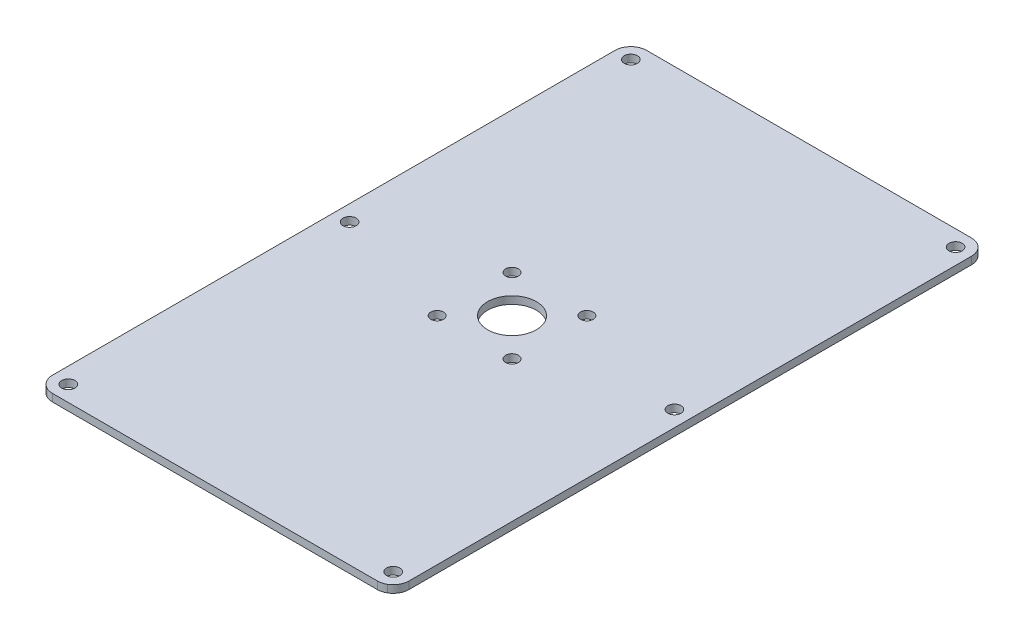
ISO-10303-21;
HEADER;
FILE_DESCRIPTION(('STEP AP214'),'2;1');
FILE_NAME('part.step','',(''),(''),'','','');
FILE_SCHEMA(('AUTOMOTIVE_DESIGN { 1 0 10303 214 1 1 1 1 }'));
ENDSEC;
DATA;
#1=APPLICATION_CONTEXT('core data for automotive mechanical design processes');
#2=APPLICATION_PROTOCOL_DEFINITION('international standard','automotive_design',2000,#1);
#3=PRODUCT_CONTEXT('',#1,'mechanical');
#4=PRODUCT('Part','Part','',(#3));
#5=PRODUCT_RELATED_PRODUCT_CATEGORY('part','',(#4));
#6=PRODUCT_DEFINITION_FORMATION('','',#4);
#7=PRODUCT_DEFINITION_CONTEXT('part definition',#1,'design');
#8=PRODUCT_DEFINITION('design','',#6,#7);
#9=PRODUCT_DEFINITION_SHAPE('','',#8);
#10=(LENGTH_UNIT() NAMED_UNIT(*) SI_UNIT(.MILLI.,.METRE.));
#11=(NAMED_UNIT(*) PLANE_ANGLE_UNIT() SI_UNIT($,.RADIAN.));
#12=(NAMED_UNIT(*) SI_UNIT($,.STERADIAN.) SOLID_ANGLE_UNIT());
#13=UNCERTAINTY_MEASURE_WITH_UNIT(LENGTH_MEASURE(1.E-05),#10,'distance_accuracy_value','');
#14=(GEOMETRIC_REPRESENTATION_CONTEXT(3) GLOBAL_UNCERTAINTY_ASSIGNED_CONTEXT((#13)) GLOBAL_UNIT_ASSIGNED_CONTEXT((#10,
#11,#12)) REPRESENTATION_CONTEXT('',''));
#15=CARTESIAN_POINT('',(0.,0.,0.));
#16=DIRECTION('',(0.,0.,1.));
#17=DIRECTION('',(1.,0.,0.));
#18=AXIS2_PLACEMENT_3D('',#15,#16,#17);
#19=CARTESIAN_POINT('',(0.,3.,0.));
#20=DIRECTION('',(0.,-1.,0.));
#21=DIRECTION('',(0.,0.,-1.));
#22=AXIS2_PLACEMENT_3D('',#19,#20,#21);
#23=PLANE('',#22);
#24=CARTESIAN_POINT('',(-15.,3.,15.));
#25=DIRECTION('',(0.,1.,0.));
#26=DIRECTION('',(0.,0.,1.));
#27=AXIS2_PLACEMENT_3D('',#24,#25,#26);
#28=CIRCLE('',#27,2.55);
#29=CARTESIAN_POINT('',(-15.,3.,17.55));
#30=VERTEX_POINT('',#29);
#31=EDGE_CURVE('E383',#30,#30,#28,.T.);
#32=ORIENTED_EDGE('',*,*,#31,.F.);
#33=EDGE_LOOP('',(#32));
#34=FACE_BOUND('',#33,.T.);
#35=CARTESIAN_POINT('',(15.,3.,15.));
#36=DIRECTION('',(0.,1.,0.));
#37=DIRECTION('',(0.,0.,1.));
#38=AXIS2_PLACEMENT_3D('',#35,#36,#37);
#39=CIRCLE('',#38,2.55);
#40=CARTESIAN_POINT('',(15.,3.,17.55));
#41=VERTEX_POINT('',#40);
#42=EDGE_CURVE('E393',#41,#41,#39,.T.);
#43=ORIENTED_EDGE('',*,*,#42,.F.);
#44=EDGE_LOOP('',(#43));
#45=FACE_BOUND('',#44,.T.);
#46=CARTESIAN_POINT('',(15.,3.,-15.));
#47=DIRECTION('',(0.,1.,0.));
#48=DIRECTION('',(0.,0.,1.));
#49=AXIS2_PLACEMENT_3D('',#46,#47,#48);
#50=CIRCLE('',#49,2.55);
#51=CARTESIAN_POINT('',(15.,3.,-12.45));
#52=VERTEX_POINT('',#51);
#53=EDGE_CURVE('E402',#52,#52,#50,.T.);
#54=ORIENTED_EDGE('',*,*,#53,.F.);
#55=EDGE_LOOP('',(#54));
#56=FACE_BOUND('',#55,.T.);
#57=CARTESIAN_POINT('',(-15.,3.,-15.));
#58=DIRECTION('',(0.,1.,0.));
#59=DIRECTION('',(0.,0.,1.));
#60=AXIS2_PLACEMENT_3D('',#57,#58,#59);
#61=CIRCLE('',#60,2.55);
#62=CARTESIAN_POINT('',(-15.,3.,-12.45));
#63=VERTEX_POINT('',#62);
#64=EDGE_CURVE('E380',#63,#63,#61,.T.);
#65=ORIENTED_EDGE('',*,*,#64,.F.);
#66=EDGE_LOOP('',(#65));
#67=FACE_BOUND('',#66,.T.);
#68=CARTESIAN_POINT('',(0.,3.,0.));
#69=DIRECTION('',(0.,1.,0.));
#70=DIRECTION('',(0.,0.,1.));
#71=AXIS2_PLACEMENT_3D('',#68,#69,#70);
#72=CIRCLE('',#71,9.779);
#73=CARTESIAN_POINT('',(0.,3.,9.779));
#74=VERTEX_POINT('',#73);
#75=EDGE_CURVE('E373',#74,#74,#72,.T.);
#76=ORIENTED_EDGE('',*,*,#75,.F.);
#77=EDGE_LOOP('',(#76));
#78=FACE_BOUND('',#77,.T.);
#79=CARTESIAN_POINT('',(65.0875,3.,-112.7125));
#80=DIRECTION('',(0.,1.,0.));
#81=DIRECTION('',(0.,0.,1.));
#82=AXIS2_PLACEMENT_3D('',#79,#80,#81);
#83=CIRCLE('',#82,2.64999999999999);
#84=CARTESIAN_POINT('',(65.0875,3.,-110.0625));
#85=VERTEX_POINT('',#84);
#86=EDGE_CURVE('E359',#85,#85,#83,.T.);
#87=ORIENTED_EDGE('',*,*,#86,.F.);
#88=EDGE_LOOP('',(#87));
#89=FACE_BOUND('',#88,.T.);
#90=CARTESIAN_POINT('',(65.0875,3.,112.7125));
#91=DIRECTION('',(0.,1.,0.));
#92=DIRECTION('',(0.,0.,1.));
#93=AXIS2_PLACEMENT_3D('',#90,#91,#92);
#94=CIRCLE('',#93,2.64999999999999);
#95=CARTESIAN_POINT('',(65.0875,3.,115.3625));
#96=VERTEX_POINT('',#95);
#97=EDGE_CURVE('E355',#96,#96,#94,.T.);
#98=ORIENTED_EDGE('',*,*,#97,.F.);
#99=EDGE_LOOP('',(#98));
#100=FACE_BOUND('',#99,.T.);
#101=CARTESIAN_POINT('',(65.0875,3.,0.));
#102=DIRECTION('',(0.,1.,0.));
#103=DIRECTION('',(0.,0.,1.));
#104=AXIS2_PLACEMENT_3D('',#101,#102,#103);
#105=CIRCLE('',#104,2.64999999999999);
#106=CARTESIAN_POINT('',(65.0875,3.,2.65000000000003));
#107=VERTEX_POINT('',#106);
#108=EDGE_CURVE('E328',#107,#107,#105,.T.);
#109=ORIENTED_EDGE('',*,*,#108,.F.);
#110=EDGE_LOOP('',(#109));
#111=FACE_BOUND('',#110,.T.);
#112=CARTESIAN_POINT('',(0.,3.,0.));
#113=DIRECTION('',(0.,1.,0.));
#114=DIRECTION('',(0.,0.,1.));
#115=AXIS2_PLACEMENT_3D('',#112,#113,#114);
#116=CIRCLE('',#115,136.5);
#117=CARTESIAN_POINT('',(68.2512830229782,3.,118.21172685363));
#118=VERTEX_POINT('',#117);
#119=CARTESIAN_POINT('',(68.2631098732232,3.,118.204897658415));
#120=VERTEX_POINT('',#119);
#121=EDGE_CURVE('E164',#118,#120,#116,.T.);
#122=ORIENTED_EDGE('',*,*,#121,.T.);
#123=CARTESIAN_POINT('',(65.0875,3.,112.705988499946));
#124=DIRECTION('',(0.,-1.,0.));
#125=DIRECTION('',(0.,0.,-1.));
#126=AXIS2_PLACEMENT_3D('',#123,#124,#125);
#127=CIRCLE('',#126,6.35);
#128=CARTESIAN_POINT('',(71.4375,3.,112.705988499946));
#129=VERTEX_POINT('',#128);
#130=EDGE_CURVE('E217',#120,#129,#127,.F.);
#131=ORIENTED_EDGE('',*,*,#130,.T.);
#132=DIRECTION('',(0.,0.,-1.));
#133=VECTOR('',#132,1.);
#134=CARTESIAN_POINT('',(71.4375,3.,119.0625));
#135=LINE('',#134,#133);
#136=CARTESIAN_POINT('',(71.4375,3.,-112.705988499946));
#137=VERTEX_POINT('',#136);
#138=EDGE_CURVE('E293',#129,#137,#135,.T.);
#139=ORIENTED_EDGE('',*,*,#138,.T.);
#140=CARTESIAN_POINT('',(65.0875,3.,-112.705988499946));
#141=DIRECTION('',(0.,-1.,0.));
#142=DIRECTION('',(0.,0.,-1.));
#143=AXIS2_PLACEMENT_3D('',#140,#141,#142);
#144=CIRCLE('',#143,6.35);
#145=CARTESIAN_POINT('',(68.2631098732232,3.,-118.204897658415));
#146=VERTEX_POINT('',#145);
#147=EDGE_CURVE('E216',#137,#146,#144,.F.);
#148=ORIENTED_EDGE('',*,*,#147,.T.);
#149=CARTESIAN_POINT('',(68.2512830229782,3.,-118.21172685363));
#150=VERTEX_POINT('',#149);
#151=EDGE_CURVE('E187',#146,#150,#116,.T.);
#152=ORIENTED_EDGE('',*,*,#151,.T.);
#153=CARTESIAN_POINT('',(65.0762233365613,3.,-112.7125));
#154=DIRECTION('',(0.,-1.,0.));
#155=DIRECTION('',(0.,0.,-1.));
#156=AXIS2_PLACEMENT_3D('',#153,#154,#155);
#157=CIRCLE('',#156,6.35);
#158=CARTESIAN_POINT('',(65.0762233365613,3.,-119.0625));
#159=VERTEX_POINT('',#158);
#160=EDGE_CURVE('E214',#150,#159,#157,.F.);
#161=ORIENTED_EDGE('',*,*,#160,.T.);
#162=DIRECTION('',(-1.,0.,0.));
#163=VECTOR('',#162,1.);
#164=CARTESIAN_POINT('',(-71.4375,3.,-119.0625));
#165=LINE('',#164,#163);
#166=CARTESIAN_POINT('',(-65.0762233365613,3.,-119.0625));
#167=VERTEX_POINT('',#166);
#168=EDGE_CURVE('E298',#159,#167,#165,.T.);
#169=ORIENTED_EDGE('',*,*,#168,.T.);
#170=CARTESIAN_POINT('',(-65.0762233365613,3.,-112.7125));
#171=DIRECTION('',(0.,-1.,0.));
#172=DIRECTION('',(0.,0.,-1.));
#173=AXIS2_PLACEMENT_3D('',#170,#171,#172);
#174=CIRCLE('',#173,6.35);
#175=CARTESIAN_POINT('',(-68.2512830229782,3.,-118.21172685363));
#176=VERTEX_POINT('',#175);
#177=EDGE_CURVE('E208',#167,#176,#174,.F.);
#178=ORIENTED_EDGE('',*,*,#177,.T.);
#179=CARTESIAN_POINT('',(-68.2631098732232,3.,-118.204897658415));
#180=VERTEX_POINT('',#179);
#181=EDGE_CURVE('E325',#176,#180,#116,.T.);
#182=ORIENTED_EDGE('',*,*,#181,.T.);
#183=CARTESIAN_POINT('',(-65.0875,3.,-112.705988499946));
#184=DIRECTION('',(0.,-1.,0.));
#185=DIRECTION('',(0.,0.,-1.));
#186=AXIS2_PLACEMENT_3D('',#183,#184,#185);
#187=CIRCLE('',#186,6.35);
#188=CARTESIAN_POINT('',(-71.4375,3.,-112.705988499946));
#189=VERTEX_POINT('',#188);
#190=EDGE_CURVE('E173',#180,#189,#187,.F.);
#191=ORIENTED_EDGE('',*,*,#190,.T.);
#192=DIRECTION('',(0.,0.,1.));
#193=VECTOR('',#192,1.);
#194=CARTESIAN_POINT('',(-71.4375,3.,119.0625));
#195=LINE('',#194,#193);
#196=CARTESIAN_POINT('',(-71.4375,3.,112.705988499946));
#197=VERTEX_POINT('',#196);
#198=EDGE_CURVE('E313',#189,#197,#195,.T.);
#199=ORIENTED_EDGE('',*,*,#198,.T.);
#200=CARTESIAN_POINT('',(-65.0875,3.,112.705988499946));
#201=DIRECTION('',(0.,-1.,0.));
#202=DIRECTION('',(0.,0.,-1.));
#203=AXIS2_PLACEMENT_3D('',#200,#201,#202);
#204=CIRCLE('',#203,6.35);
#205=CARTESIAN_POINT('',(-68.2631098732232,3.,118.204897658415));
#206=VERTEX_POINT('',#205);
#207=EDGE_CURVE('E210',#197,#206,#204,.F.);
#208=ORIENTED_EDGE('',*,*,#207,.T.);
#209=CARTESIAN_POINT('',(-68.2512830229782,3.,118.21172685363));
#210=VERTEX_POINT('',#209);
#211=EDGE_CURVE('E189',#206,#210,#116,.T.);
#212=ORIENTED_EDGE('',*,*,#211,.T.);
#213=CARTESIAN_POINT('',(-65.0762233365613,3.,112.7125));
#214=DIRECTION('',(0.,-1.,0.));
#215=DIRECTION('',(0.,0.,-1.));
#216=AXIS2_PLACEMENT_3D('',#213,#214,#215);
#217=CIRCLE('',#216,6.35);
#218=CARTESIAN_POINT('',(-65.0762233365613,3.,119.0625));
#219=VERTEX_POINT('',#218);
#220=EDGE_CURVE('E175',#210,#219,#217,.F.);
#221=ORIENTED_EDGE('',*,*,#220,.T.);
#222=DIRECTION('',(1.,0.,0.));
#223=VECTOR('',#222,1.);
#224=CARTESIAN_POINT('',(-71.4375,3.,119.0625));
#225=LINE('',#224,#223);
#226=CARTESIAN_POINT('',(65.0762233365613,3.,119.0625));
#227=VERTEX_POINT('',#226);
#228=EDGE_CURVE('E170',#219,#227,#225,.T.);
#229=ORIENTED_EDGE('',*,*,#228,.T.);
#230=CARTESIAN_POINT('',(65.0762233365613,3.,112.7125));
#231=DIRECTION('',(0.,-1.,0.));
#232=DIRECTION('',(0.,0.,-1.));
#233=AXIS2_PLACEMENT_3D('',#230,#231,#232);
#234=CIRCLE('',#233,6.35);
#235=EDGE_CURVE('E162',#227,#118,#234,.F.);
#236=ORIENTED_EDGE('',*,*,#235,.T.);
#237=EDGE_LOOP('',(#122,#131,#139,#148,#152,#161,#169,#178,#182,#191,#199,#208,#212,#221,#229,#236));
#238=FACE_BOUND('',#237,.T.);
#239=CARTESIAN_POINT('',(-65.0875,3.,0.));
#240=DIRECTION('',(0.,1.,0.));
#241=DIRECTION('',(0.,0.,1.));
#242=AXIS2_PLACEMENT_3D('',#239,#240,#241);
#243=CIRCLE('',#242,2.64999999999999);
#244=CARTESIAN_POINT('',(-65.0875,3.,2.65000000000003));
#245=VERTEX_POINT('',#244);
#246=EDGE_CURVE('E337',#245,#245,#243,.T.);
#247=ORIENTED_EDGE('',*,*,#246,.F.);
#248=EDGE_LOOP('',(#247));
#249=FACE_BOUND('',#248,.T.);
#250=CARTESIAN_POINT('',(-65.0875,3.,112.7125));
#251=DIRECTION('',(0.,1.,0.));
#252=DIRECTION('',(0.,0.,1.));
#253=AXIS2_PLACEMENT_3D('',#250,#251,#252);
#254=CIRCLE('',#253,2.64999999999999);
#255=CARTESIAN_POINT('',(-65.0875,3.,115.3625));
#256=VERTEX_POINT('',#255);
#257=EDGE_CURVE('E341',#256,#256,#254,.T.);
#258=ORIENTED_EDGE('',*,*,#257,.F.);
#259=EDGE_LOOP('',(#258));
#260=FACE_BOUND('',#259,.T.);
#261=CARTESIAN_POINT('',(-65.0875,3.,-112.7125));
#262=DIRECTION('',(0.,1.,0.));
#263=DIRECTION('',(0.,0.,1.));
#264=AXIS2_PLACEMENT_3D('',#261,#262,#263);
#265=CIRCLE('',#264,2.64999999999999);
#266=CARTESIAN_POINT('',(-65.0875,3.,-110.0625));
#267=VERTEX_POINT('',#266);
#268=EDGE_CURVE('E368',#267,#267,#265,.T.);
#269=ORIENTED_EDGE('',*,*,#268,.F.);
#270=EDGE_LOOP('',(#269));
#271=FACE_BOUND('',#270,.T.);
#272=ADVANCED_FACE('F44',(#34,#45,#56,#67,#78,#89,#100,#111,#238,#249,#260,#271),#23,.F.);
#273=CARTESIAN_POINT('',(71.4375,3.,119.0625));
#274=DIRECTION('',(-1.,0.,0.));
#275=DIRECTION('',(0.,0.,1.));
#276=AXIS2_PLACEMENT_3D('',#273,#274,#275);
#277=PLANE('',#276);
#278=ORIENTED_EDGE('',*,*,#138,.F.);
#279=DIRECTION('',(0.,-1.,0.));
#280=VECTOR('',#279,1.);
#281=CARTESIAN_POINT('',(71.4375,0.,112.705988499946));
#282=LINE('',#281,#280);
#283=CARTESIAN_POINT('',(71.4375,0.,112.705988499946));
#284=VERTEX_POINT('',#283);
#285=EDGE_CURVE('E223',#129,#284,#282,.T.);
#286=ORIENTED_EDGE('',*,*,#285,.T.);
#287=DIRECTION('',(0.,0.,-1.));
#288=VECTOR('',#287,1.);
#289=CARTESIAN_POINT('',(71.4375,0.,119.0625));
#290=LINE('',#289,#288);
#291=CARTESIAN_POINT('',(71.4375,0.,-112.705988499946));
#292=VERTEX_POINT('',#291);
#293=EDGE_CURVE('E304',#284,#292,#290,.T.);
#294=ORIENTED_EDGE('',*,*,#293,.T.);
#295=DIRECTION('',(0.,-1.,0.));
#296=VECTOR('',#295,1.);
#297=CARTESIAN_POINT('',(71.4375,3.,-112.705988499946));
#298=LINE('',#297,#296);
#299=EDGE_CURVE('E225',#292,#137,#298,.F.);
#300=ORIENTED_EDGE('',*,*,#299,.T.);
#301=EDGE_LOOP('',(#278,#286,#294,#300));
#302=FACE_BOUND('',#301,.T.);
#303=ADVANCED_FACE('F420',(#302),#277,.F.);
#304=CARTESIAN_POINT('',(-71.4375,3.,-119.0625));
#305=DIRECTION('',(0.,0.,1.));
#306=DIRECTION('',(1.,0.,0.));
#307=AXIS2_PLACEMENT_3D('',#304,#305,#306);
#308=PLANE('',#307);
#309=ORIENTED_EDGE('',*,*,#168,.F.);
#310=DIRECTION('',(0.,-1.,0.));
#311=VECTOR('',#310,1.);
#312=CARTESIAN_POINT('',(65.0762233365613,0.,-119.0625));
#313=LINE('',#312,#311);
#314=CARTESIAN_POINT('',(65.0762233365613,0.,-119.0625));
#315=VERTEX_POINT('',#314);
#316=EDGE_CURVE('E256',#159,#315,#313,.T.);
#317=ORIENTED_EDGE('',*,*,#316,.T.);
#318=DIRECTION('',(-1.,0.,0.));
#319=VECTOR('',#318,1.);
#320=CARTESIAN_POINT('',(-71.4375,0.,-119.0625));
#321=LINE('',#320,#319);
#322=CARTESIAN_POINT('',(-65.0762233365613,0.,-119.0625));
#323=VERTEX_POINT('',#322);
#324=EDGE_CURVE('E299',#315,#323,#321,.T.);
#325=ORIENTED_EDGE('',*,*,#324,.T.);
#326=DIRECTION('',(0.,-1.,0.));
#327=VECTOR('',#326,1.);
#328=CARTESIAN_POINT('',(-65.0762233365613,3.,-119.0625));
#329=LINE('',#328,#327);
#330=EDGE_CURVE('E257',#323,#167,#329,.F.);
#331=ORIENTED_EDGE('',*,*,#330,.T.);
#332=EDGE_LOOP('',(#309,#317,#325,#331));
#333=FACE_BOUND('',#332,.T.);
#334=ADVANCED_FACE('F468',(#333),#308,.F.);
#335=CARTESIAN_POINT('',(-71.4375,3.,119.0625));
#336=DIRECTION('',(1.,0.,0.));
#337=DIRECTION('',(0.,0.,-1.));
#338=AXIS2_PLACEMENT_3D('',#335,#336,#337);
#339=PLANE('',#338);
#340=DIRECTION('',(0.,0.,1.));
#341=VECTOR('',#340,1.);
#342=CARTESIAN_POINT('',(-71.4375,0.,119.0625));
#343=LINE('',#342,#341);
#344=CARTESIAN_POINT('',(-71.4375,0.,-112.705988499946));
#345=VERTEX_POINT('',#344);
#346=CARTESIAN_POINT('',(-71.4375,0.,112.705988499946));
#347=VERTEX_POINT('',#346);
#348=EDGE_CURVE('E292',#345,#347,#343,.T.);
#349=ORIENTED_EDGE('',*,*,#348,.T.);
#350=DIRECTION('',(0.,-1.,0.));
#351=VECTOR('',#350,1.);
#352=CARTESIAN_POINT('',(-71.4375,3.,112.705988499946));
#353=LINE('',#352,#351);
#354=EDGE_CURVE('E281',#347,#197,#353,.F.);
#355=ORIENTED_EDGE('',*,*,#354,.T.);
#356=ORIENTED_EDGE('',*,*,#198,.F.);
#357=DIRECTION('',(0.,-1.,0.));
#358=VECTOR('',#357,1.);
#359=CARTESIAN_POINT('',(-71.4375,0.,-112.705988499946));
#360=LINE('',#359,#358);
#361=EDGE_CURVE('E279',#189,#345,#360,.T.);
#362=ORIENTED_EDGE('',*,*,#361,.T.);
#363=EDGE_LOOP('',(#349,#355,#356,#362));
#364=FACE_BOUND('',#363,.T.);
#365=ADVANCED_FACE('F512',(#364),#339,.F.);
#366=CARTESIAN_POINT('',(-71.4375,3.,119.0625));
#367=DIRECTION('',(0.,0.,-1.));
#368=DIRECTION('',(-1.,0.,0.));
#369=AXIS2_PLACEMENT_3D('',#366,#367,#368);
#370=PLANE('',#369);
#371=ORIENTED_EDGE('',*,*,#228,.F.);
#372=DIRECTION('',(0.,-1.,0.));
#373=VECTOR('',#372,1.);
#374=CARTESIAN_POINT('',(-65.0762233365613,0.,119.0625));
#375=LINE('',#374,#373);
#376=CARTESIAN_POINT('',(-65.0762233365613,0.,119.0625));
#377=VERTEX_POINT('',#376);
#378=EDGE_CURVE('E12',#219,#377,#375,.T.);
#379=ORIENTED_EDGE('',*,*,#378,.T.);
#380=DIRECTION('',(1.,0.,0.));
#381=VECTOR('',#380,1.);
#382=CARTESIAN_POINT('',(-71.4375,0.,119.0625));
#383=LINE('',#382,#381);
#384=CARTESIAN_POINT('',(65.0762233365613,0.,119.0625));
#385=VERTEX_POINT('',#384);
#386=EDGE_CURVE('E199',#377,#385,#383,.T.);
#387=ORIENTED_EDGE('',*,*,#386,.T.);
#388=DIRECTION('',(0.,-1.,0.));
#389=VECTOR('',#388,1.);
#390=CARTESIAN_POINT('',(65.0762233365613,3.,119.0625));
#391=LINE('',#390,#389);
#392=EDGE_CURVE('E53',#385,#227,#391,.F.);
#393=ORIENTED_EDGE('',*,*,#392,.T.);
#394=EDGE_LOOP('',(#371,#379,#387,#393));
#395=FACE_BOUND('',#394,.T.);
#396=ADVANCED_FACE('F287',(#395),#370,.F.);
#397=CARTESIAN_POINT('',(0.,0.,0.));
#398=DIRECTION('',(0.,-1.,0.));
#399=DIRECTION('',(0.,0.,-1.));
#400=AXIS2_PLACEMENT_3D('',#397,#398,#399);
#401=PLANE('',#400);
#402=CARTESIAN_POINT('',(-15.,0.,15.));
#403=DIRECTION('',(0.,1.,0.));
#404=DIRECTION('',(0.,0.,1.));
#405=AXIS2_PLACEMENT_3D('',#402,#403,#404);
#406=CIRCLE('',#405,2.55);
#407=CARTESIAN_POINT('',(-15.,0.,17.55));
#408=VERTEX_POINT('',#407);
#409=EDGE_CURVE('E382',#408,#408,#406,.T.);
#410=ORIENTED_EDGE('',*,*,#409,.T.);
#411=EDGE_LOOP('',(#410));
#412=FACE_BOUND('',#411,.T.);
#413=CARTESIAN_POINT('',(15.,0.,15.));
#414=DIRECTION('',(0.,1.,0.));
#415=DIRECTION('',(0.,0.,1.));
#416=AXIS2_PLACEMENT_3D('',#413,#414,#415);
#417=CIRCLE('',#416,2.55);
#418=CARTESIAN_POINT('',(15.,0.,17.55));
#419=VERTEX_POINT('',#418);
#420=EDGE_CURVE('E386',#419,#419,#417,.T.);
#421=ORIENTED_EDGE('',*,*,#420,.T.);
#422=EDGE_LOOP('',(#421));
#423=FACE_BOUND('',#422,.T.);
#424=CARTESIAN_POINT('',(15.,0.,-15.));
#425=DIRECTION('',(0.,1.,0.));
#426=DIRECTION('',(0.,0.,1.));
#427=AXIS2_PLACEMENT_3D('',#424,#425,#426);
#428=CIRCLE('',#427,2.55);
#429=CARTESIAN_POINT('',(15.,0.,-12.45));
#430=VERTEX_POINT('',#429);
#431=EDGE_CURVE('E400',#430,#430,#428,.T.);
#432=ORIENTED_EDGE('',*,*,#431,.T.);
#433=EDGE_LOOP('',(#432));
#434=FACE_BOUND('',#433,.T.);
#435=CARTESIAN_POINT('',(-15.,0.,-15.));
#436=DIRECTION('',(0.,1.,0.));
#437=DIRECTION('',(0.,0.,1.));
#438=AXIS2_PLACEMENT_3D('',#435,#436,#437);
#439=CIRCLE('',#438,2.55);
#440=CARTESIAN_POINT('',(-15.,0.,-12.45));
#441=VERTEX_POINT('',#440);
#442=EDGE_CURVE('E403',#441,#441,#439,.T.);
#443=ORIENTED_EDGE('',*,*,#442,.T.);
#444=EDGE_LOOP('',(#443));
#445=FACE_BOUND('',#444,.T.);
#446=CARTESIAN_POINT('',(0.,0.,0.));
#447=DIRECTION('',(0.,1.,0.));
#448=DIRECTION('',(0.,0.,1.));
#449=AXIS2_PLACEMENT_3D('',#446,#447,#448);
#450=CIRCLE('',#449,9.779);
#451=CARTESIAN_POINT('',(0.,0.,9.779));
#452=VERTEX_POINT('',#451);
#453=EDGE_CURVE('E375',#452,#452,#450,.T.);
#454=ORIENTED_EDGE('',*,*,#453,.T.);
#455=EDGE_LOOP('',(#454));
#456=FACE_BOUND('',#455,.T.);
#457=CARTESIAN_POINT('',(-65.0875,0.,-112.7125));
#458=DIRECTION('',(0.,-1.,0.));
#459=DIRECTION('',(0.,0.,-1.));
#460=AXIS2_PLACEMENT_3D('',#457,#458,#459);
#461=CIRCLE('',#460,2.64999999999999);
#462=CARTESIAN_POINT('',(-65.0875,0.,-115.3625));
#463=VERTEX_POINT('',#462);
#464=EDGE_CURVE('E364',#463,#463,#461,.T.);
#465=ORIENTED_EDGE('',*,*,#464,.F.);
#466=EDGE_LOOP('',(#465));
#467=FACE_BOUND('',#466,.T.);
#468=CARTESIAN_POINT('',(65.0875,0.,-112.7125));
#469=DIRECTION('',(0.,-1.,0.));
#470=DIRECTION('',(0.,0.,-1.));
#471=AXIS2_PLACEMENT_3D('',#468,#469,#470);
#472=CIRCLE('',#471,2.64999999999999);
#473=CARTESIAN_POINT('',(65.0875,0.,-115.3625));
#474=VERTEX_POINT('',#473);
#475=EDGE_CURVE('E358',#474,#474,#472,.T.);
#476=ORIENTED_EDGE('',*,*,#475,.F.);
#477=EDGE_LOOP('',(#476));
#478=FACE_BOUND('',#477,.T.);
#479=CARTESIAN_POINT('',(65.0875,0.,112.7125));
#480=DIRECTION('',(0.,-1.,0.));
#481=DIRECTION('',(0.,0.,-1.));
#482=AXIS2_PLACEMENT_3D('',#479,#480,#481);
#483=CIRCLE('',#482,2.64999999999999);
#484=CARTESIAN_POINT('',(65.0875,0.,110.0625));
#485=VERTEX_POINT('',#484);
#486=EDGE_CURVE('E348',#485,#485,#483,.T.);
#487=ORIENTED_EDGE('',*,*,#486,.F.);
#488=EDGE_LOOP('',(#487));
#489=FACE_BOUND('',#488,.T.);
#490=CARTESIAN_POINT('',(-65.0875,0.,112.7125));
#491=DIRECTION('',(0.,-1.,0.));
#492=DIRECTION('',(0.,0.,-1.));
#493=AXIS2_PLACEMENT_3D('',#490,#491,#492);
#494=CIRCLE('',#493,2.64999999999999);
#495=CARTESIAN_POINT('',(-65.0875,0.,110.0625));
#496=VERTEX_POINT('',#495);
#497=EDGE_CURVE('E338',#496,#496,#494,.T.);
#498=ORIENTED_EDGE('',*,*,#497,.F.);
#499=EDGE_LOOP('',(#498));
#500=FACE_BOUND('',#499,.T.);
#501=CARTESIAN_POINT('',(-65.0875,0.,0.));
#502=DIRECTION('',(0.,-1.,0.));
#503=DIRECTION('',(0.,0.,-1.));
#504=AXIS2_PLACEMENT_3D('',#501,#502,#503);
#505=CIRCLE('',#504,2.64999999999999);
#506=CARTESIAN_POINT('',(-65.0875,0.,-2.64999999999995));
#507=VERTEX_POINT('',#506);
#508=EDGE_CURVE('E335',#507,#507,#505,.T.);
#509=ORIENTED_EDGE('',*,*,#508,.F.);
#510=EDGE_LOOP('',(#509));
#511=FACE_BOUND('',#510,.T.);
#512=CARTESIAN_POINT('',(65.0875,0.,0.));
#513=DIRECTION('',(0.,-1.,0.));
#514=DIRECTION('',(0.,0.,-1.));
#515=AXIS2_PLACEMENT_3D('',#512,#513,#514);
#516=CIRCLE('',#515,2.64999999999999);
#517=CARTESIAN_POINT('',(65.0875,0.,-2.64999999999995));
#518=VERTEX_POINT('',#517);
#519=EDGE_CURVE('E324',#518,#518,#516,.T.);
#520=ORIENTED_EDGE('',*,*,#519,.F.);
#521=EDGE_LOOP('',(#520));
#522=FACE_BOUND('',#521,.T.);
#523=ORIENTED_EDGE('',*,*,#293,.F.);
#524=CARTESIAN_POINT('',(65.0875,0.,112.705988499946));
#525=DIRECTION('',(0.,-1.,0.));
#526=DIRECTION('',(0.,0.,-1.));
#527=AXIS2_PLACEMENT_3D('',#524,#525,#526);
#528=CIRCLE('',#527,6.35);
#529=CARTESIAN_POINT('',(68.2631098732232,0.,118.204897658415));
#530=VERTEX_POINT('',#529);
#531=EDGE_CURVE('E246',#284,#530,#528,.T.);
#532=ORIENTED_EDGE('',*,*,#531,.T.);
#533=CARTESIAN_POINT('',(0.,0.,0.));
#534=DIRECTION('',(0.,1.,0.));
#535=DIRECTION('',(0.,0.,1.));
#536=AXIS2_PLACEMENT_3D('',#533,#534,#535);
#537=CIRCLE('',#536,136.5);
#538=CARTESIAN_POINT('',(68.2512830229782,0.,118.21172685363));
#539=VERTEX_POINT('',#538);
#540=EDGE_CURVE('E184',#539,#530,#537,.T.);
#541=ORIENTED_EDGE('',*,*,#540,.F.);
#542=CARTESIAN_POINT('',(65.0762233365613,0.,112.7125));
#543=DIRECTION('',(0.,-1.,0.));
#544=DIRECTION('',(0.,0.,-1.));
#545=AXIS2_PLACEMENT_3D('',#542,#543,#544);
#546=CIRCLE('',#545,6.35);
#547=EDGE_CURVE('E188',#539,#385,#546,.T.);
#548=ORIENTED_EDGE('',*,*,#547,.T.);
#549=ORIENTED_EDGE('',*,*,#386,.F.);
#550=CARTESIAN_POINT('',(-65.0762233365613,0.,112.7125));
#551=DIRECTION('',(0.,-1.,0.));
#552=DIRECTION('',(0.,0.,-1.));
#553=AXIS2_PLACEMENT_3D('',#550,#551,#552);
#554=CIRCLE('',#553,6.35);
#555=CARTESIAN_POINT('',(-68.2512830229782,0.,118.21172685363));
#556=VERTEX_POINT('',#555);
#557=EDGE_CURVE('E231',#377,#556,#554,.T.);
#558=ORIENTED_EDGE('',*,*,#557,.T.);
#559=CARTESIAN_POINT('',(-68.2631098732232,0.,118.204897658415));
#560=VERTEX_POINT('',#559);
#561=EDGE_CURVE('E312',#560,#556,#537,.T.);
#562=ORIENTED_EDGE('',*,*,#561,.F.);
#563=CARTESIAN_POINT('',(-65.0875,0.,112.705988499946));
#564=DIRECTION('',(0.,-1.,0.));
#565=DIRECTION('',(0.,0.,-1.));
#566=AXIS2_PLACEMENT_3D('',#563,#564,#565);
#567=CIRCLE('',#566,6.35);
#568=EDGE_CURVE('E236',#560,#347,#567,.T.);
#569=ORIENTED_EDGE('',*,*,#568,.T.);
#570=ORIENTED_EDGE('',*,*,#348,.F.);
#571=CARTESIAN_POINT('',(-65.0875,0.,-112.705988499946));
#572=DIRECTION('',(0.,-1.,0.));
#573=DIRECTION('',(0.,0.,-1.));
#574=AXIS2_PLACEMENT_3D('',#571,#572,#573);
#575=CIRCLE('',#574,6.35);
#576=CARTESIAN_POINT('',(-68.2631098732232,0.,-118.204897658415));
#577=VERTEX_POINT('',#576);
#578=EDGE_CURVE('E226',#345,#577,#575,.T.);
#579=ORIENTED_EDGE('',*,*,#578,.T.);
#580=CARTESIAN_POINT('',(-68.2512830229782,0.,-118.21172685363));
#581=VERTEX_POINT('',#580);
#582=EDGE_CURVE('E200',#581,#577,#537,.T.);
#583=ORIENTED_EDGE('',*,*,#582,.F.);
#584=CARTESIAN_POINT('',(-65.0762233365613,0.,-112.7125));
#585=DIRECTION('',(0.,-1.,0.));
#586=DIRECTION('',(0.,0.,-1.));
#587=AXIS2_PLACEMENT_3D('',#584,#585,#586);
#588=CIRCLE('',#587,6.35);
#589=EDGE_CURVE('E237',#581,#323,#588,.T.);
#590=ORIENTED_EDGE('',*,*,#589,.T.);
#591=ORIENTED_EDGE('',*,*,#324,.F.);
#592=CARTESIAN_POINT('',(65.0762233365613,0.,-112.7125));
#593=DIRECTION('',(0.,-1.,0.));
#594=DIRECTION('',(0.,0.,-1.));
#595=AXIS2_PLACEMENT_3D('',#592,#593,#594);
#596=CIRCLE('',#595,6.35);
#597=CARTESIAN_POINT('',(68.2512830229782,0.,-118.21172685363));
#598=VERTEX_POINT('',#597);
#599=EDGE_CURVE('E62',#315,#598,#596,.T.);
#600=ORIENTED_EDGE('',*,*,#599,.T.);
#601=CARTESIAN_POINT('',(68.2631098732232,0.,-118.204897658415));
#602=VERTEX_POINT('',#601);
#603=EDGE_CURVE('E195',#602,#598,#537,.T.);
#604=ORIENTED_EDGE('',*,*,#603,.F.);
#605=CARTESIAN_POINT('',(65.0875,0.,-112.705988499946));
#606=DIRECTION('',(0.,-1.,0.));
#607=DIRECTION('',(0.,0.,-1.));
#608=AXIS2_PLACEMENT_3D('',#605,#606,#607);
#609=CIRCLE('',#608,6.35);
#610=EDGE_CURVE('E67',#602,#292,#609,.T.);
#611=ORIENTED_EDGE('',*,*,#610,.T.);
#612=EDGE_LOOP('',(#523,#532,#541,#548,#549,#558,#562,#569,#570,#579,#583,#590,#591,#600,#604,#611));
#613=FACE_BOUND('',#612,.T.);
#614=ADVANCED_FACE('F436',(#412,#423,#434,#445,#456,#467,#478,#489,#500,#511,#522,#613),#401,.T.);
#615=CARTESIAN_POINT('',(0.,0.,0.));
#616=DIRECTION('',(0.,1.,0.));
#617=DIRECTION('',(0.,0.,1.));
#618=AXIS2_PLACEMENT_3D('',#615,#616,#617);
#619=CYLINDRICAL_SURFACE('',#618,136.5);
#620=ORIENTED_EDGE('',*,*,#540,.T.);
#621=DIRECTION('',(0.,1.,0.));
#622=VECTOR('',#621,1.);
#623=CARTESIAN_POINT('',(68.2631098732232,0.,118.204897658415));
#624=LINE('',#623,#622);
#625=EDGE_CURVE('E182',#530,#120,#624,.T.);
#626=ORIENTED_EDGE('',*,*,#625,.T.);
#627=ORIENTED_EDGE('',*,*,#121,.F.);
#628=DIRECTION('',(0.,1.,0.));
#629=VECTOR('',#628,1.);
#630=CARTESIAN_POINT('',(68.2512830229782,0.,118.21172685363));
#631=LINE('',#630,#629);
#632=EDGE_CURVE('E179',#118,#539,#631,.F.);
#633=ORIENTED_EDGE('',*,*,#632,.T.);
#634=EDGE_LOOP('',(#620,#626,#627,#633));
#635=FACE_BOUND('',#634,.T.);
#636=ADVANCED_FACE('F177',(#635),#619,.T.);
#637=ORIENTED_EDGE('',*,*,#211,.F.);
#638=DIRECTION('',(0.,1.,0.));
#639=VECTOR('',#638,1.);
#640=CARTESIAN_POINT('',(-68.2631098732232,0.,118.204897658415));
#641=LINE('',#640,#639);
#642=EDGE_CURVE('E274',#206,#560,#641,.F.);
#643=ORIENTED_EDGE('',*,*,#642,.T.);
#644=ORIENTED_EDGE('',*,*,#561,.T.);
#645=DIRECTION('',(0.,1.,0.));
#646=VECTOR('',#645,1.);
#647=CARTESIAN_POINT('',(-68.2512830229782,0.,118.21172685363));
#648=LINE('',#647,#646);
#649=EDGE_CURVE('E268',#556,#210,#648,.T.);
#650=ORIENTED_EDGE('',*,*,#649,.T.);
#651=EDGE_LOOP('',(#637,#643,#644,#650));
#652=FACE_BOUND('',#651,.T.);
#653=ADVANCED_FACE('F507',(#652),#619,.T.);
#654=ORIENTED_EDGE('',*,*,#181,.F.);
#655=DIRECTION('',(0.,1.,0.));
#656=VECTOR('',#655,1.);
#657=CARTESIAN_POINT('',(-68.2512830229782,0.,-118.21172685363));
#658=LINE('',#657,#656);
#659=EDGE_CURVE('E267',#176,#581,#658,.F.);
#660=ORIENTED_EDGE('',*,*,#659,.T.);
#661=ORIENTED_EDGE('',*,*,#582,.T.);
#662=DIRECTION('',(0.,1.,0.));
#663=VECTOR('',#662,1.);
#664=CARTESIAN_POINT('',(-68.2631098732232,0.,-118.204897658415));
#665=LINE('',#664,#663);
#666=EDGE_CURVE('E265',#577,#180,#665,.T.);
#667=ORIENTED_EDGE('',*,*,#666,.T.);
#668=EDGE_LOOP('',(#654,#660,#661,#667));
#669=FACE_BOUND('',#668,.T.);
#670=ADVANCED_FACE('F462',(#669),#619,.T.);
#671=ORIENTED_EDGE('',*,*,#151,.F.);
#672=DIRECTION('',(0.,1.,0.));
#673=VECTOR('',#672,1.);
#674=CARTESIAN_POINT('',(68.2631098732232,0.,-118.204897658415));
#675=LINE('',#674,#673);
#676=EDGE_CURVE('E254',#146,#602,#675,.F.);
#677=ORIENTED_EDGE('',*,*,#676,.T.);
#678=ORIENTED_EDGE('',*,*,#603,.T.);
#679=DIRECTION('',(0.,1.,0.));
#680=VECTOR('',#679,1.);
#681=CARTESIAN_POINT('',(68.2512830229782,0.,-118.21172685363));
#682=LINE('',#681,#680);
#683=EDGE_CURVE('E248',#598,#150,#682,.T.);
#684=ORIENTED_EDGE('',*,*,#683,.T.);
#685=EDGE_LOOP('',(#671,#677,#678,#684));
#686=FACE_BOUND('',#685,.T.);
#687=ADVANCED_FACE('F435',(#686),#619,.T.);
#688=CARTESIAN_POINT('',(65.0875,3.,0.));
#689=DIRECTION('',(0.,1.,0.));
#690=DIRECTION('',(0.,0.,1.));
#691=AXIS2_PLACEMENT_3D('',#688,#689,#690);
#692=CYLINDRICAL_SURFACE('',#691,2.64999999999999);
#693=ORIENTED_EDGE('',*,*,#108,.T.);
#694=EDGE_LOOP('',(#693));
#695=FACE_BOUND('',#694,.T.);
#696=ORIENTED_EDGE('',*,*,#519,.T.);
#697=EDGE_LOOP('',(#696));
#698=FACE_BOUND('',#697,.T.);
#699=ADVANCED_FACE('F426',(#695,#698),#692,.F.);
#700=CARTESIAN_POINT('',(-65.0875,3.,0.));
#701=DIRECTION('',(0.,1.,0.));
#702=DIRECTION('',(0.,0.,1.));
#703=AXIS2_PLACEMENT_3D('',#700,#701,#702);
#704=CYLINDRICAL_SURFACE('',#703,2.64999999999999);
#705=ORIENTED_EDGE('',*,*,#246,.T.);
#706=EDGE_LOOP('',(#705));
#707=FACE_BOUND('',#706,.T.);
#708=ORIENTED_EDGE('',*,*,#508,.T.);
#709=EDGE_LOOP('',(#708));
#710=FACE_BOUND('',#709,.T.);
#711=ADVANCED_FACE('F431',(#707,#710),#704,.F.);
#712=CARTESIAN_POINT('',(-65.0875,3.,112.7125));
#713=DIRECTION('',(0.,1.,0.));
#714=DIRECTION('',(0.,0.,1.));
#715=AXIS2_PLACEMENT_3D('',#712,#713,#714);
#716=CYLINDRICAL_SURFACE('',#715,2.64999999999999);
#717=ORIENTED_EDGE('',*,*,#257,.T.);
#718=EDGE_LOOP('',(#717));
#719=FACE_BOUND('',#718,.T.);
#720=ORIENTED_EDGE('',*,*,#497,.T.);
#721=EDGE_LOOP('',(#720));
#722=FACE_BOUND('',#721,.T.);
#723=ADVANCED_FACE('F558',(#719,#722),#716,.F.);
#724=CARTESIAN_POINT('',(65.0875,3.,112.7125));
#725=DIRECTION('',(0.,1.,0.));
#726=DIRECTION('',(0.,0.,1.));
#727=AXIS2_PLACEMENT_3D('',#724,#725,#726);
#728=CYLINDRICAL_SURFACE('',#727,2.64999999999999);
#729=ORIENTED_EDGE('',*,*,#97,.T.);
#730=EDGE_LOOP('',(#729));
#731=FACE_BOUND('',#730,.T.);
#732=ORIENTED_EDGE('',*,*,#486,.T.);
#733=EDGE_LOOP('',(#732));
#734=FACE_BOUND('',#733,.T.);
#735=ADVANCED_FACE('F552',(#731,#734),#728,.F.);
#736=CARTESIAN_POINT('',(65.0875,3.,-112.7125));
#737=DIRECTION('',(0.,1.,0.));
#738=DIRECTION('',(0.,0.,1.));
#739=AXIS2_PLACEMENT_3D('',#736,#737,#738);
#740=CYLINDRICAL_SURFACE('',#739,2.64999999999999);
#741=ORIENTED_EDGE('',*,*,#86,.T.);
#742=EDGE_LOOP('',(#741));
#743=FACE_BOUND('',#742,.T.);
#744=ORIENTED_EDGE('',*,*,#475,.T.);
#745=EDGE_LOOP('',(#744));
#746=FACE_BOUND('',#745,.T.);
#747=ADVANCED_FACE('F549',(#743,#746),#740,.F.);
#748=CARTESIAN_POINT('',(-65.0875,3.,-112.7125));
#749=DIRECTION('',(0.,1.,0.));
#750=DIRECTION('',(0.,0.,1.));
#751=AXIS2_PLACEMENT_3D('',#748,#749,#750);
#752=CYLINDRICAL_SURFACE('',#751,2.64999999999999);
#753=ORIENTED_EDGE('',*,*,#268,.T.);
#754=EDGE_LOOP('',(#753));
#755=FACE_BOUND('',#754,.T.);
#756=ORIENTED_EDGE('',*,*,#464,.T.);
#757=EDGE_LOOP('',(#756));
#758=FACE_BOUND('',#757,.T.);
#759=ADVANCED_FACE('F542',(#755,#758),#752,.F.);
#760=CARTESIAN_POINT('',(0.,0.,0.));
#761=DIRECTION('',(0.,1.,0.));
#762=DIRECTION('',(0.,0.,1.));
#763=AXIS2_PLACEMENT_3D('',#760,#761,#762);
#764=CYLINDRICAL_SURFACE('',#763,9.779);
#765=ORIENTED_EDGE('',*,*,#453,.F.);
#766=EDGE_LOOP('',(#765));
#767=FACE_BOUND('',#766,.T.);
#768=ORIENTED_EDGE('',*,*,#75,.T.);
#769=EDGE_LOOP('',(#768));
#770=FACE_BOUND('',#769,.T.);
#771=ADVANCED_FACE('F541',(#767,#770),#764,.F.);
#772=CARTESIAN_POINT('',(-15.,0.,-15.));
#773=DIRECTION('',(0.,1.,0.));
#774=DIRECTION('',(0.,0.,1.));
#775=AXIS2_PLACEMENT_3D('',#772,#773,#774);
#776=CYLINDRICAL_SURFACE('',#775,2.55);
#777=ORIENTED_EDGE('',*,*,#442,.F.);
#778=EDGE_LOOP('',(#777));
#779=FACE_BOUND('',#778,.T.);
#780=ORIENTED_EDGE('',*,*,#64,.T.);
#781=EDGE_LOOP('',(#780));
#782=FACE_BOUND('',#781,.T.);
#783=ADVANCED_FACE('F413',(#779,#782),#776,.F.);
#784=CARTESIAN_POINT('',(15.,0.,-15.));
#785=DIRECTION('',(0.,1.,0.));
#786=DIRECTION('',(0.,0.,1.));
#787=AXIS2_PLACEMENT_3D('',#784,#785,#786);
#788=CYLINDRICAL_SURFACE('',#787,2.55);
#789=ORIENTED_EDGE('',*,*,#431,.F.);
#790=EDGE_LOOP('',(#789));
#791=FACE_BOUND('',#790,.T.);
#792=ORIENTED_EDGE('',*,*,#53,.T.);
#793=EDGE_LOOP('',(#792));
#794=FACE_BOUND('',#793,.T.);
#795=ADVANCED_FACE('F534',(#791,#794),#788,.F.);
#796=CARTESIAN_POINT('',(15.,0.,15.));
#797=DIRECTION('',(0.,1.,0.));
#798=DIRECTION('',(0.,0.,1.));
#799=AXIS2_PLACEMENT_3D('',#796,#797,#798);
#800=CYLINDRICAL_SURFACE('',#799,2.55);
#801=ORIENTED_EDGE('',*,*,#420,.F.);
#802=EDGE_LOOP('',(#801));
#803=FACE_BOUND('',#802,.T.);
#804=ORIENTED_EDGE('',*,*,#42,.T.);
#805=EDGE_LOOP('',(#804));
#806=FACE_BOUND('',#805,.T.);
#807=ADVANCED_FACE('F529',(#803,#806),#800,.F.);
#808=CARTESIAN_POINT('',(-15.,0.,15.));
#809=DIRECTION('',(0.,1.,0.));
#810=DIRECTION('',(0.,0.,1.));
#811=AXIS2_PLACEMENT_3D('',#808,#809,#810);
#812=CYLINDRICAL_SURFACE('',#811,2.55);
#813=ORIENTED_EDGE('',*,*,#409,.F.);
#814=EDGE_LOOP('',(#813));
#815=FACE_BOUND('',#814,.T.);
#816=ORIENTED_EDGE('',*,*,#31,.T.);
#817=EDGE_LOOP('',(#816));
#818=FACE_BOUND('',#817,.T.);
#819=ADVANCED_FACE('F523',(#815,#818),#812,.F.);
#820=CARTESIAN_POINT('',(65.0875,0.,112.705988499946));
#821=DIRECTION('',(0.,1.,0.));
#822=DIRECTION('',(0.,0.,1.));
#823=AXIS2_PLACEMENT_3D('',#820,#821,#822);
#824=CYLINDRICAL_SURFACE('',#823,6.35);
#825=ORIENTED_EDGE('',*,*,#531,.F.);
#826=ORIENTED_EDGE('',*,*,#285,.F.);
#827=ORIENTED_EDGE('',*,*,#130,.F.);
#828=ORIENTED_EDGE('',*,*,#625,.F.);
#829=EDGE_LOOP('',(#825,#826,#827,#828));
#830=FACE_BOUND('',#829,.T.);
#831=ADVANCED_FACE('F444',(#830),#824,.T.);
#832=CARTESIAN_POINT('',(65.0875,0.,-112.705988499946));
#833=DIRECTION('',(0.,1.,0.));
#834=DIRECTION('',(0.,0.,1.));
#835=AXIS2_PLACEMENT_3D('',#832,#833,#834);
#836=CYLINDRICAL_SURFACE('',#835,6.35);
#837=ORIENTED_EDGE('',*,*,#147,.F.);
#838=ORIENTED_EDGE('',*,*,#299,.F.);
#839=ORIENTED_EDGE('',*,*,#610,.F.);
#840=ORIENTED_EDGE('',*,*,#676,.F.);
#841=EDGE_LOOP('',(#837,#838,#839,#840));
#842=FACE_BOUND('',#841,.T.);
#843=ADVANCED_FACE('F449',(#842),#836,.T.);
#844=CARTESIAN_POINT('',(65.0762233365613,0.,-112.7125));
#845=DIRECTION('',(0.,1.,0.));
#846=DIRECTION('',(0.,0.,1.));
#847=AXIS2_PLACEMENT_3D('',#844,#845,#846);
#848=CYLINDRICAL_SURFACE('',#847,6.35);
#849=ORIENTED_EDGE('',*,*,#599,.F.);
#850=ORIENTED_EDGE('',*,*,#316,.F.);
#851=ORIENTED_EDGE('',*,*,#160,.F.);
#852=ORIENTED_EDGE('',*,*,#683,.F.);
#853=EDGE_LOOP('',(#849,#850,#851,#852));
#854=FACE_BOUND('',#853,.T.);
#855=ADVANCED_FACE('F474',(#854),#848,.T.);
#856=CARTESIAN_POINT('',(-65.0762233365613,0.,-112.7125));
#857=DIRECTION('',(0.,1.,0.));
#858=DIRECTION('',(0.,0.,1.));
#859=AXIS2_PLACEMENT_3D('',#856,#857,#858);
#860=CYLINDRICAL_SURFACE('',#859,6.35);
#861=ORIENTED_EDGE('',*,*,#177,.F.);
#862=ORIENTED_EDGE('',*,*,#330,.F.);
#863=ORIENTED_EDGE('',*,*,#589,.F.);
#864=ORIENTED_EDGE('',*,*,#659,.F.);
#865=EDGE_LOOP('',(#861,#862,#863,#864));
#866=FACE_BOUND('',#865,.T.);
#867=ADVANCED_FACE('F467',(#866),#860,.T.);
#868=CARTESIAN_POINT('',(-65.0875,0.,112.705988499946));
#869=DIRECTION('',(0.,1.,0.));
#870=DIRECTION('',(0.,0.,1.));
#871=AXIS2_PLACEMENT_3D('',#868,#869,#870);
#872=CYLINDRICAL_SURFACE('',#871,6.35);
#873=ORIENTED_EDGE('',*,*,#207,.F.);
#874=ORIENTED_EDGE('',*,*,#354,.F.);
#875=ORIENTED_EDGE('',*,*,#568,.F.);
#876=ORIENTED_EDGE('',*,*,#642,.F.);
#877=EDGE_LOOP('',(#873,#874,#875,#876));
#878=FACE_BOUND('',#877,.T.);
#879=ADVANCED_FACE('F479',(#878),#872,.T.);
#880=CARTESIAN_POINT('',(-65.0762233365613,0.,112.7125));
#881=DIRECTION('',(0.,1.,0.));
#882=DIRECTION('',(0.,0.,1.));
#883=AXIS2_PLACEMENT_3D('',#880,#881,#882);
#884=CYLINDRICAL_SURFACE('',#883,6.35);
#885=ORIENTED_EDGE('',*,*,#557,.F.);
#886=ORIENTED_EDGE('',*,*,#378,.F.);
#887=ORIENTED_EDGE('',*,*,#220,.F.);
#888=ORIENTED_EDGE('',*,*,#649,.F.);
#889=EDGE_LOOP('',(#885,#886,#887,#888));
#890=FACE_BOUND('',#889,.T.);
#891=ADVANCED_FACE('F487',(#890),#884,.T.);
#892=CARTESIAN_POINT('',(65.0762233365613,0.,112.7125));
#893=DIRECTION('',(0.,1.,0.));
#894=DIRECTION('',(0.,0.,1.));
#895=AXIS2_PLACEMENT_3D('',#892,#893,#894);
#896=CYLINDRICAL_SURFACE('',#895,6.35);
#897=ORIENTED_EDGE('',*,*,#235,.F.);
#898=ORIENTED_EDGE('',*,*,#392,.F.);
#899=ORIENTED_EDGE('',*,*,#547,.F.);
#900=ORIENTED_EDGE('',*,*,#632,.F.);
#901=EDGE_LOOP('',(#897,#898,#899,#900));
#902=FACE_BOUND('',#901,.T.);
#903=ADVANCED_FACE('F186',(#902),#896,.T.);
#904=CARTESIAN_POINT('',(-65.0875,0.,-112.705988499946));
#905=DIRECTION('',(0.,1.,0.));
#906=DIRECTION('',(0.,0.,1.));
#907=AXIS2_PLACEMENT_3D('',#904,#905,#906);
#908=CYLINDRICAL_SURFACE('',#907,6.35);
#909=ORIENTED_EDGE('',*,*,#578,.F.);
#910=ORIENTED_EDGE('',*,*,#361,.F.);
#911=ORIENTED_EDGE('',*,*,#190,.F.);
#912=ORIENTED_EDGE('',*,*,#666,.F.);
#913=EDGE_LOOP('',(#909,#910,#911,#912));
#914=FACE_BOUND('',#913,.T.);
#915=ADVANCED_FACE('F50',(#914),#908,.T.);
#916=CLOSED_SHELL('',(#272,#303,#334,#365,#396,#614,#636,#653,#670,#687,#699,#711,#723,#735,
#747,#759,#771,#783,#795,#807,#819,#831,#843,#855,#867,#879,#891,#903,#915));
#917=MANIFOLD_SOLID_BREP('B2',#916);
#918=ADVANCED_BREP_SHAPE_REPRESENTATION('',(#18,#917),#14);
#919=SHAPE_DEFINITION_REPRESENTATION(#9,#918);
ENDSEC;
END-ISO-10303-21;
